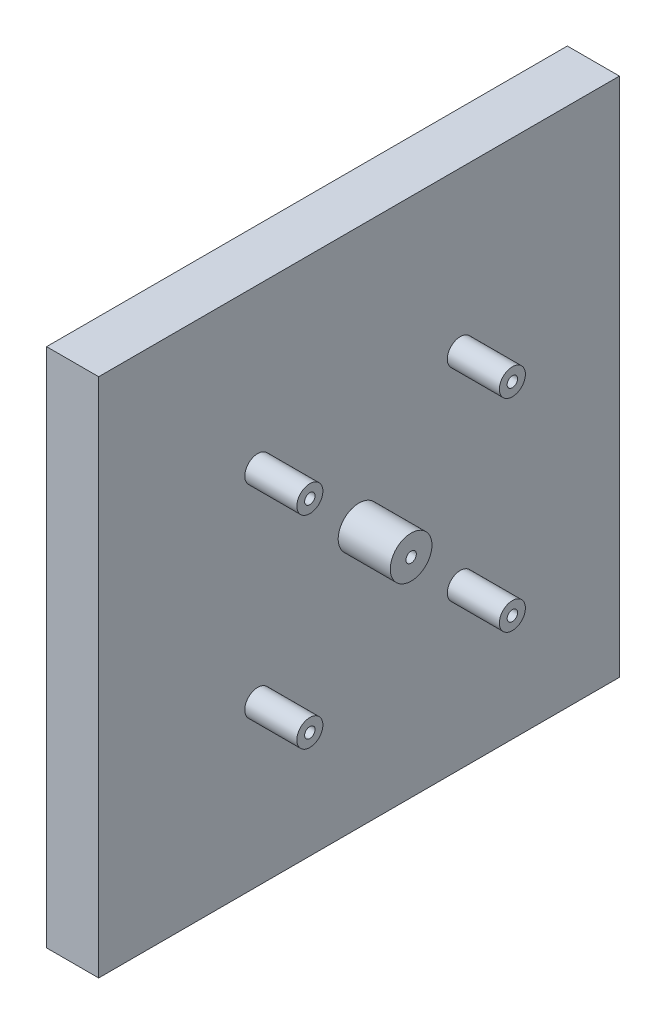
ISO-10303-21;
HEADER;
FILE_DESCRIPTION(('STEP AP214'),'2;1');
FILE_NAME('part.step','',(''),(''),'','','');
FILE_SCHEMA(('AUTOMOTIVE_DESIGN { 1 0 10303 214 1 1 1 1 }'));
ENDSEC;
DATA;
#1=APPLICATION_CONTEXT('core data for automotive mechanical design processes');
#2=APPLICATION_PROTOCOL_DEFINITION('international standard','automotive_design',2000,#1);
#3=PRODUCT_CONTEXT('',#1,'mechanical');
#4=PRODUCT('Part','Part','',(#3));
#5=PRODUCT_RELATED_PRODUCT_CATEGORY('part','',(#4));
#6=PRODUCT_DEFINITION_FORMATION('','',#4);
#7=PRODUCT_DEFINITION_CONTEXT('part definition',#1,'design');
#8=PRODUCT_DEFINITION('design','',#6,#7);
#9=PRODUCT_DEFINITION_SHAPE('','',#8);
#10=(LENGTH_UNIT() NAMED_UNIT(*) SI_UNIT(.MILLI.,.METRE.));
#11=(NAMED_UNIT(*) PLANE_ANGLE_UNIT() SI_UNIT($,.RADIAN.));
#12=(NAMED_UNIT(*) SI_UNIT($,.STERADIAN.) SOLID_ANGLE_UNIT());
#13=UNCERTAINTY_MEASURE_WITH_UNIT(LENGTH_MEASURE(1.E-05),#10,'distance_accuracy_value','');
#14=(GEOMETRIC_REPRESENTATION_CONTEXT(3) GLOBAL_UNCERTAINTY_ASSIGNED_CONTEXT((#13)) GLOBAL_UNIT_ASSIGNED_CONTEXT((#10,
#11,#12)) REPRESENTATION_CONTEXT('',''));
#15=CARTESIAN_POINT('',(0.,0.,0.));
#16=DIRECTION('',(0.,0.,1.));
#17=DIRECTION('',(1.,0.,0.));
#18=AXIS2_PLACEMENT_3D('',#15,#16,#17);
#19=CARTESIAN_POINT('',(10.,0.,0.));
#20=DIRECTION('',(1.,0.,0.));
#21=DIRECTION('',(0.,0.,-1.));
#22=AXIS2_PLACEMENT_3D('',#19,#20,#21);
#23=PLANE('',#22);
#24=CARTESIAN_POINT('',(10.,-19.4454364826299,19.4454364826302));
#25=DIRECTION('',(1.,0.,0.));
#26=DIRECTION('',(0.,0.,-1.));
#27=AXIS2_PLACEMENT_3D('',#24,#25,#26);
#28=CIRCLE('',#27,2.5);
#29=CARTESIAN_POINT('',(10.,-19.4454364826299,16.9454364826302));
#30=VERTEX_POINT('',#29);
#31=EDGE_CURVE('E153',#30,#30,#28,.T.);
#32=ORIENTED_EDGE('',*,*,#31,.F.);
#33=EDGE_LOOP('',(#32));
#34=FACE_BOUND('',#33,.T.);
#35=CARTESIAN_POINT('',(10.,0.,0.));
#36=DIRECTION('',(1.,0.,0.));
#37=DIRECTION('',(0.,0.,-1.));
#38=AXIS2_PLACEMENT_3D('',#35,#36,#37);
#39=CIRCLE('',#38,4.);
#40=CARTESIAN_POINT('',(10.,0.,-4.));
#41=VERTEX_POINT('',#40);
#42=EDGE_CURVE('E135',#41,#41,#39,.T.);
#43=ORIENTED_EDGE('',*,*,#42,.F.);
#44=EDGE_LOOP('',(#43));
#45=FACE_BOUND('',#44,.T.);
#46=DIRECTION('',(0.,0.,1.));
#47=VECTOR('',#46,1.);
#48=CARTESIAN_POINT('',(10.,50.,-50.));
#49=LINE('',#48,#47);
#50=CARTESIAN_POINT('',(10.,50.,-50.));
#51=VERTEX_POINT('',#50);
#52=CARTESIAN_POINT('',(10.,50.,50.));
#53=VERTEX_POINT('',#52);
#54=EDGE_CURVE('E84',#51,#53,#49,.T.);
#55=ORIENTED_EDGE('',*,*,#54,.T.);
#56=DIRECTION('',(0.,-1.,0.));
#57=VECTOR('',#56,1.);
#58=CARTESIAN_POINT('',(10.,50.,50.));
#59=LINE('',#58,#57);
#60=CARTESIAN_POINT('',(10.,-50.,50.));
#61=VERTEX_POINT('',#60);
#62=EDGE_CURVE('E79',#53,#61,#59,.T.);
#63=ORIENTED_EDGE('',*,*,#62,.T.);
#64=DIRECTION('',(0.,0.,-1.));
#65=VECTOR('',#64,1.);
#66=CARTESIAN_POINT('',(10.,-50.,50.));
#67=LINE('',#66,#65);
#68=CARTESIAN_POINT('',(10.,-50.,-50.));
#69=VERTEX_POINT('',#68);
#70=EDGE_CURVE('E82',#61,#69,#67,.T.);
#71=ORIENTED_EDGE('',*,*,#70,.T.);
#72=DIRECTION('',(0.,1.,0.));
#73=VECTOR('',#72,1.);
#74=CARTESIAN_POINT('',(10.,-50.,-50.));
#75=LINE('',#74,#73);
#76=EDGE_CURVE('E49',#69,#51,#75,.T.);
#77=ORIENTED_EDGE('',*,*,#76,.T.);
#78=EDGE_LOOP('',(#55,#63,#71,#77));
#79=FACE_BOUND('',#78,.T.);
#80=CARTESIAN_POINT('',(10.,19.4454364826301,-19.4454364826301));
#81=DIRECTION('',(1.,0.,0.));
#82=DIRECTION('',(0.,0.,-1.));
#83=AXIS2_PLACEMENT_3D('',#80,#81,#82);
#84=CIRCLE('',#83,2.5);
#85=CARTESIAN_POINT('',(10.,19.4454364826301,-21.9454364826301));
#86=VERTEX_POINT('',#85);
#87=EDGE_CURVE('E126',#86,#86,#84,.T.);
#88=ORIENTED_EDGE('',*,*,#87,.F.);
#89=EDGE_LOOP('',(#88));
#90=FACE_BOUND('',#89,.T.);
#91=CARTESIAN_POINT('',(10.,-19.4454364826301,-19.44543648263));
#92=DIRECTION('',(1.,0.,0.));
#93=DIRECTION('',(0.,0.,-1.));
#94=AXIS2_PLACEMENT_3D('',#91,#92,#93);
#95=CIRCLE('',#94,2.5);
#96=CARTESIAN_POINT('',(10.,-19.4454364826301,-21.94543648263));
#97=VERTEX_POINT('',#96);
#98=EDGE_CURVE('E144',#97,#97,#95,.T.);
#99=ORIENTED_EDGE('',*,*,#98,.F.);
#100=EDGE_LOOP('',(#99));
#101=FACE_BOUND('',#100,.T.);
#102=CARTESIAN_POINT('',(10.,19.4454364826303,19.4454364826298));
#103=DIRECTION('',(1.,0.,0.));
#104=DIRECTION('',(0.,0.,-1.));
#105=AXIS2_PLACEMENT_3D('',#102,#103,#104);
#106=CIRCLE('',#105,2.5);
#107=CARTESIAN_POINT('',(10.,19.4454364826303,16.9454364826299));
#108=VERTEX_POINT('',#107);
#109=EDGE_CURVE('E162',#108,#108,#106,.T.);
#110=ORIENTED_EDGE('',*,*,#109,.F.);
#111=EDGE_LOOP('',(#110));
#112=FACE_BOUND('',#111,.T.);
#113=ADVANCED_FACE('F32',(#34,#45,#79,#90,#101,#112),#23,.T.);
#114=CARTESIAN_POINT('',(0.,0.,0.));
#115=DIRECTION('',(1.,0.,0.));
#116=DIRECTION('',(0.,0.,-1.));
#117=AXIS2_PLACEMENT_3D('',#114,#115,#116);
#118=PLANE('',#117);
#119=DIRECTION('',(0.,0.,1.));
#120=VECTOR('',#119,1.);
#121=CARTESIAN_POINT('',(0.,50.,-50.));
#122=LINE('',#121,#120);
#123=CARTESIAN_POINT('',(0.,50.,-50.));
#124=VERTEX_POINT('',#123);
#125=CARTESIAN_POINT('',(0.,50.,50.));
#126=VERTEX_POINT('',#125);
#127=EDGE_CURVE('E96',#124,#126,#122,.T.);
#128=ORIENTED_EDGE('',*,*,#127,.F.);
#129=DIRECTION('',(0.,1.,0.));
#130=VECTOR('',#129,1.);
#131=CARTESIAN_POINT('',(0.,-50.,-50.));
#132=LINE('',#131,#130);
#133=CARTESIAN_POINT('',(0.,-50.,-50.));
#134=VERTEX_POINT('',#133);
#135=EDGE_CURVE('E72',#134,#124,#132,.T.);
#136=ORIENTED_EDGE('',*,*,#135,.F.);
#137=DIRECTION('',(0.,0.,-1.));
#138=VECTOR('',#137,1.);
#139=CARTESIAN_POINT('',(0.,-50.,50.));
#140=LINE('',#139,#138);
#141=CARTESIAN_POINT('',(0.,-50.,50.));
#142=VERTEX_POINT('',#141);
#143=EDGE_CURVE('E66',#142,#134,#140,.T.);
#144=ORIENTED_EDGE('',*,*,#143,.F.);
#145=DIRECTION('',(0.,-1.,0.));
#146=VECTOR('',#145,1.);
#147=CARTESIAN_POINT('',(0.,50.,50.));
#148=LINE('',#147,#146);
#149=EDGE_CURVE('E88',#126,#142,#148,.T.);
#150=ORIENTED_EDGE('',*,*,#149,.F.);
#151=EDGE_LOOP('',(#128,#136,#144,#150));
#152=FACE_BOUND('',#151,.T.);
#153=CARTESIAN_POINT('',(0.,19.4454364826301,-19.4454364826301));
#154=DIRECTION('',(1.,0.,0.));
#155=DIRECTION('',(0.,0.,-1.));
#156=AXIS2_PLACEMENT_3D('',#153,#154,#155);
#157=CIRCLE('',#156,1.);
#158=CARTESIAN_POINT('',(0.,19.4454364826301,-20.4454364826301));
#159=VERTEX_POINT('',#158);
#160=EDGE_CURVE('E99',#159,#159,#157,.T.);
#161=ORIENTED_EDGE('',*,*,#160,.T.);
#162=EDGE_LOOP('',(#161));
#163=FACE_BOUND('',#162,.T.);
#164=CARTESIAN_POINT('',(0.,-19.4454364826301,-19.4454364826301));
#165=DIRECTION('',(1.,0.,0.));
#166=DIRECTION('',(0.,0.,-1.));
#167=AXIS2_PLACEMENT_3D('',#164,#165,#166);
#168=CIRCLE('',#167,1.);
#169=CARTESIAN_POINT('',(0.,-19.4454364826301,-20.4454364826301));
#170=VERTEX_POINT('',#169);
#171=EDGE_CURVE('E113',#170,#170,#168,.T.);
#172=ORIENTED_EDGE('',*,*,#171,.T.);
#173=EDGE_LOOP('',(#172));
#174=FACE_BOUND('',#173,.T.);
#175=CARTESIAN_POINT('',(0.,0.,0.));
#176=DIRECTION('',(1.,0.,0.));
#177=DIRECTION('',(0.,0.,-1.));
#178=AXIS2_PLACEMENT_3D('',#175,#176,#177);
#179=CIRCLE('',#178,1.);
#180=CARTESIAN_POINT('',(0.,0.,-1.));
#181=VERTEX_POINT('',#180);
#182=EDGE_CURVE('E116',#181,#181,#179,.T.);
#183=ORIENTED_EDGE('',*,*,#182,.T.);
#184=EDGE_LOOP('',(#183));
#185=FACE_BOUND('',#184,.T.);
#186=CARTESIAN_POINT('',(0.,-19.4454364826301,19.44543648263));
#187=DIRECTION('',(1.,0.,0.));
#188=DIRECTION('',(0.,0.,-1.));
#189=AXIS2_PLACEMENT_3D('',#186,#187,#188);
#190=CIRCLE('',#189,1.00000000000001);
#191=CARTESIAN_POINT('',(0.,-19.4454364826301,18.44543648263));
#192=VERTEX_POINT('',#191);
#193=EDGE_CURVE('E119',#192,#192,#190,.T.);
#194=ORIENTED_EDGE('',*,*,#193,.T.);
#195=EDGE_LOOP('',(#194));
#196=FACE_BOUND('',#195,.T.);
#197=CARTESIAN_POINT('',(0.,19.4454364826301,19.4454364826301));
#198=DIRECTION('',(1.,0.,0.));
#199=DIRECTION('',(0.,0.,-1.));
#200=AXIS2_PLACEMENT_3D('',#197,#198,#199);
#201=CIRCLE('',#200,1.);
#202=CARTESIAN_POINT('',(0.,19.4454364826301,18.4454364826301));
#203=VERTEX_POINT('',#202);
#204=EDGE_CURVE('E122',#203,#203,#201,.T.);
#205=ORIENTED_EDGE('',*,*,#204,.T.);
#206=EDGE_LOOP('',(#205));
#207=FACE_BOUND('',#206,.T.);
#208=ADVANCED_FACE('F107',(#152,#163,#174,#185,#196,#207),#118,.F.);
#209=CARTESIAN_POINT('',(10.,50.,-50.));
#210=DIRECTION('',(0.,-1.,0.));
#211=DIRECTION('',(0.,0.,-1.));
#212=AXIS2_PLACEMENT_3D('',#209,#210,#211);
#213=PLANE('',#212);
#214=ORIENTED_EDGE('',*,*,#127,.T.);
#215=DIRECTION('',(-1.,0.,0.));
#216=VECTOR('',#215,1.);
#217=CARTESIAN_POINT('',(10.,50.,50.));
#218=LINE('',#217,#216);
#219=EDGE_CURVE('E11',#53,#126,#218,.T.);
#220=ORIENTED_EDGE('',*,*,#219,.F.);
#221=ORIENTED_EDGE('',*,*,#54,.F.);
#222=DIRECTION('',(-1.,0.,0.));
#223=VECTOR('',#222,1.);
#224=CARTESIAN_POINT('',(10.,50.,-50.));
#225=LINE('',#224,#223);
#226=EDGE_CURVE('E92',#51,#124,#225,.T.);
#227=ORIENTED_EDGE('',*,*,#226,.T.);
#228=EDGE_LOOP('',(#214,#220,#221,#227));
#229=FACE_BOUND('',#228,.T.);
#230=ADVANCED_FACE('F34',(#229),#213,.F.);
#231=CARTESIAN_POINT('',(10.,50.,50.));
#232=DIRECTION('',(0.,0.,-1.));
#233=DIRECTION('',(0.,1.,0.));
#234=AXIS2_PLACEMENT_3D('',#231,#232,#233);
#235=PLANE('',#234);
#236=ORIENTED_EDGE('',*,*,#149,.T.);
#237=DIRECTION('',(-1.,0.,0.));
#238=VECTOR('',#237,1.);
#239=CARTESIAN_POINT('',(10.,-50.,50.));
#240=LINE('',#239,#238);
#241=EDGE_CURVE('E41',#61,#142,#240,.T.);
#242=ORIENTED_EDGE('',*,*,#241,.F.);
#243=ORIENTED_EDGE('',*,*,#62,.F.);
#244=ORIENTED_EDGE('',*,*,#219,.T.);
#245=EDGE_LOOP('',(#236,#242,#243,#244));
#246=FACE_BOUND('',#245,.T.);
#247=ADVANCED_FACE('F87',(#246),#235,.F.);
#248=CARTESIAN_POINT('',(10.,-50.,50.));
#249=DIRECTION('',(0.,1.,0.));
#250=DIRECTION('',(0.,0.,1.));
#251=AXIS2_PLACEMENT_3D('',#248,#249,#250);
#252=PLANE('',#251);
#253=ORIENTED_EDGE('',*,*,#143,.T.);
#254=DIRECTION('',(-1.,0.,0.));
#255=VECTOR('',#254,1.);
#256=CARTESIAN_POINT('',(10.,-50.,-50.));
#257=LINE('',#256,#255);
#258=EDGE_CURVE('E89',#69,#134,#257,.T.);
#259=ORIENTED_EDGE('',*,*,#258,.F.);
#260=ORIENTED_EDGE('',*,*,#70,.F.);
#261=ORIENTED_EDGE('',*,*,#241,.T.);
#262=EDGE_LOOP('',(#253,#259,#260,#261));
#263=FACE_BOUND('',#262,.T.);
#264=ADVANCED_FACE('F90',(#263),#252,.F.);
#265=CARTESIAN_POINT('',(10.,-50.,-50.));
#266=DIRECTION('',(0.,0.,1.));
#267=DIRECTION('',(0.,-1.,0.));
#268=AXIS2_PLACEMENT_3D('',#265,#266,#267);
#269=PLANE('',#268);
#270=ORIENTED_EDGE('',*,*,#135,.T.);
#271=ORIENTED_EDGE('',*,*,#226,.F.);
#272=ORIENTED_EDGE('',*,*,#76,.F.);
#273=ORIENTED_EDGE('',*,*,#258,.T.);
#274=EDGE_LOOP('',(#270,#271,#272,#273));
#275=FACE_BOUND('',#274,.T.);
#276=ADVANCED_FACE('F104',(#275),#269,.F.);
#277=CARTESIAN_POINT('',(10.,19.4454364826301,-19.4454364826301));
#278=DIRECTION('',(-1.,0.,0.));
#279=DIRECTION('',(0.,0.,1.));
#280=AXIS2_PLACEMENT_3D('',#277,#278,#279);
#281=CYLINDRICAL_SURFACE('',#280,1.);
#282=ORIENTED_EDGE('',*,*,#160,.F.);
#283=EDGE_LOOP('',(#282));
#284=FACE_BOUND('',#283,.T.);
#285=CARTESIAN_POINT('',(20.,19.4454364826301,-19.4454364826301));
#286=DIRECTION('',(1.,0.,0.));
#287=DIRECTION('',(0.,0.,-1.));
#288=AXIS2_PLACEMENT_3D('',#285,#286,#287);
#289=CIRCLE('',#288,1.);
#290=CARTESIAN_POINT('',(20.,19.4454364826301,-20.4454364826301));
#291=VERTEX_POINT('',#290);
#292=EDGE_CURVE('E129',#291,#291,#289,.T.);
#293=ORIENTED_EDGE('',*,*,#292,.T.);
#294=EDGE_LOOP('',(#293));
#295=FACE_BOUND('',#294,.T.);
#296=ADVANCED_FACE('F198',(#284,#295),#281,.F.);
#297=CARTESIAN_POINT('',(10.,-19.4454364826301,-19.4454364826301));
#298=DIRECTION('',(-1.,0.,0.));
#299=DIRECTION('',(0.,0.,1.));
#300=AXIS2_PLACEMENT_3D('',#297,#298,#299);
#301=CYLINDRICAL_SURFACE('',#300,1.);
#302=ORIENTED_EDGE('',*,*,#171,.F.);
#303=EDGE_LOOP('',(#302));
#304=FACE_BOUND('',#303,.T.);
#305=CARTESIAN_POINT('',(20.,-19.4454364826301,-19.44543648263));
#306=DIRECTION('',(1.,0.,0.));
#307=DIRECTION('',(0.,0.,-1.));
#308=AXIS2_PLACEMENT_3D('',#305,#306,#307);
#309=CIRCLE('',#308,1.);
#310=CARTESIAN_POINT('',(20.,-19.4454364826301,-20.44543648263));
#311=VERTEX_POINT('',#310);
#312=EDGE_CURVE('E147',#311,#311,#309,.T.);
#313=ORIENTED_EDGE('',*,*,#312,.T.);
#314=EDGE_LOOP('',(#313));
#315=FACE_BOUND('',#314,.T.);
#316=ADVANCED_FACE('F240',(#304,#315),#301,.F.);
#317=CARTESIAN_POINT('',(10.,0.,0.));
#318=DIRECTION('',(-1.,0.,0.));
#319=DIRECTION('',(0.,0.,1.));
#320=AXIS2_PLACEMENT_3D('',#317,#318,#319);
#321=CYLINDRICAL_SURFACE('',#320,1.);
#322=ORIENTED_EDGE('',*,*,#182,.F.);
#323=EDGE_LOOP('',(#322));
#324=FACE_BOUND('',#323,.T.);
#325=CARTESIAN_POINT('',(20.,0.,0.));
#326=DIRECTION('',(1.,0.,0.));
#327=DIRECTION('',(0.,0.,-1.));
#328=AXIS2_PLACEMENT_3D('',#325,#326,#327);
#329=CIRCLE('',#328,1.);
#330=CARTESIAN_POINT('',(20.,0.,-1.));
#331=VERTEX_POINT('',#330);
#332=EDGE_CURVE('E138',#331,#331,#329,.T.);
#333=ORIENTED_EDGE('',*,*,#332,.T.);
#334=EDGE_LOOP('',(#333));
#335=FACE_BOUND('',#334,.T.);
#336=ADVANCED_FACE('F251',(#324,#335),#321,.F.);
#337=CARTESIAN_POINT('',(10.,-19.4454364826301,19.44543648263));
#338=DIRECTION('',(-1.,0.,0.));
#339=DIRECTION('',(0.,0.,1.));
#340=AXIS2_PLACEMENT_3D('',#337,#338,#339);
#341=CYLINDRICAL_SURFACE('',#340,1.00000000000001);
#342=ORIENTED_EDGE('',*,*,#193,.F.);
#343=EDGE_LOOP('',(#342));
#344=FACE_BOUND('',#343,.T.);
#345=CARTESIAN_POINT('',(20.,-19.4454364826299,19.4454364826302));
#346=DIRECTION('',(1.,0.,0.));
#347=DIRECTION('',(0.,0.,-1.));
#348=AXIS2_PLACEMENT_3D('',#345,#346,#347);
#349=CIRCLE('',#348,1.);
#350=CARTESIAN_POINT('',(20.,-19.4454364826299,18.4454364826302));
#351=VERTEX_POINT('',#350);
#352=EDGE_CURVE('E156',#351,#351,#349,.T.);
#353=ORIENTED_EDGE('',*,*,#352,.T.);
#354=EDGE_LOOP('',(#353));
#355=FACE_BOUND('',#354,.T.);
#356=ADVANCED_FACE('F261',(#344,#355),#341,.F.);
#357=CARTESIAN_POINT('',(10.,19.4454364826301,19.4454364826301));
#358=DIRECTION('',(-1.,0.,0.));
#359=DIRECTION('',(0.,0.,1.));
#360=AXIS2_PLACEMENT_3D('',#357,#358,#359);
#361=CYLINDRICAL_SURFACE('',#360,1.);
#362=ORIENTED_EDGE('',*,*,#204,.F.);
#363=EDGE_LOOP('',(#362));
#364=FACE_BOUND('',#363,.T.);
#365=CARTESIAN_POINT('',(20.,19.4454364826303,19.4454364826298));
#366=DIRECTION('',(1.,0.,0.));
#367=DIRECTION('',(0.,0.,-1.));
#368=AXIS2_PLACEMENT_3D('',#365,#366,#367);
#369=CIRCLE('',#368,1.);
#370=CARTESIAN_POINT('',(20.,19.4454364826303,18.4454364826298));
#371=VERTEX_POINT('',#370);
#372=EDGE_CURVE('E165',#371,#371,#369,.T.);
#373=ORIENTED_EDGE('',*,*,#372,.T.);
#374=EDGE_LOOP('',(#373));
#375=FACE_BOUND('',#374,.T.);
#376=ADVANCED_FACE('F171',(#364,#375),#361,.F.);
#377=CARTESIAN_POINT('',(20.,19.4454364826301,-19.4454364826301));
#378=DIRECTION('',(1.,0.,0.));
#379=DIRECTION('',(0.,0.,-1.));
#380=AXIS2_PLACEMENT_3D('',#377,#378,#379);
#381=PLANE('',#380);
#382=CARTESIAN_POINT('',(20.,19.4454364826301,-19.4454364826301));
#383=DIRECTION('',(1.,0.,0.));
#384=DIRECTION('',(0.,0.,-1.));
#385=AXIS2_PLACEMENT_3D('',#382,#383,#384);
#386=CIRCLE('',#385,2.5);
#387=CARTESIAN_POINT('',(20.,19.4454364826301,-21.9454364826301));
#388=VERTEX_POINT('',#387);
#389=EDGE_CURVE('E125',#388,#388,#386,.T.);
#390=ORIENTED_EDGE('',*,*,#389,.T.);
#391=EDGE_LOOP('',(#390));
#392=FACE_BOUND('',#391,.T.);
#393=ORIENTED_EDGE('',*,*,#292,.F.);
#394=EDGE_LOOP('',(#393));
#395=FACE_BOUND('',#394,.T.);
#396=ADVANCED_FACE('F281',(#392,#395),#381,.T.);
#397=CARTESIAN_POINT('',(20.,19.4454364826301,-19.4454364826301));
#398=DIRECTION('',(-1.,0.,0.));
#399=DIRECTION('',(0.,0.,1.));
#400=AXIS2_PLACEMENT_3D('',#397,#398,#399);
#401=CYLINDRICAL_SURFACE('',#400,2.5);
#402=ORIENTED_EDGE('',*,*,#389,.F.);
#403=EDGE_LOOP('',(#402));
#404=FACE_BOUND('',#403,.T.);
#405=ORIENTED_EDGE('',*,*,#87,.T.);
#406=EDGE_LOOP('',(#405));
#407=FACE_BOUND('',#406,.T.);
#408=ADVANCED_FACE('F305',(#404,#407),#401,.T.);
#409=CARTESIAN_POINT('',(20.,0.,0.));
#410=DIRECTION('',(1.,0.,0.));
#411=DIRECTION('',(0.,0.,-1.));
#412=AXIS2_PLACEMENT_3D('',#409,#410,#411);
#413=PLANE('',#412);
#414=CARTESIAN_POINT('',(20.,0.,0.));
#415=DIRECTION('',(1.,0.,0.));
#416=DIRECTION('',(0.,0.,-1.));
#417=AXIS2_PLACEMENT_3D('',#414,#415,#416);
#418=CIRCLE('',#417,4.);
#419=CARTESIAN_POINT('',(20.,0.,-4.));
#420=VERTEX_POINT('',#419);
#421=EDGE_CURVE('E134',#420,#420,#418,.T.);
#422=ORIENTED_EDGE('',*,*,#421,.T.);
#423=EDGE_LOOP('',(#422));
#424=FACE_BOUND('',#423,.T.);
#425=ORIENTED_EDGE('',*,*,#332,.F.);
#426=EDGE_LOOP('',(#425));
#427=FACE_BOUND('',#426,.T.);
#428=ADVANCED_FACE('F315',(#424,#427),#413,.T.);
#429=CARTESIAN_POINT('',(20.,0.,0.));
#430=DIRECTION('',(-1.,0.,0.));
#431=DIRECTION('',(0.,0.,1.));
#432=AXIS2_PLACEMENT_3D('',#429,#430,#431);
#433=CYLINDRICAL_SURFACE('',#432,4.);
#434=ORIENTED_EDGE('',*,*,#421,.F.);
#435=EDGE_LOOP('',(#434));
#436=FACE_BOUND('',#435,.T.);
#437=ORIENTED_EDGE('',*,*,#42,.T.);
#438=EDGE_LOOP('',(#437));
#439=FACE_BOUND('',#438,.T.);
#440=ADVANCED_FACE('F325',(#436,#439),#433,.T.);
#441=CARTESIAN_POINT('',(20.,-19.4454364826301,-19.44543648263));
#442=DIRECTION('',(1.,0.,0.));
#443=DIRECTION('',(0.,0.,-1.));
#444=AXIS2_PLACEMENT_3D('',#441,#442,#443);
#445=PLANE('',#444);
#446=CARTESIAN_POINT('',(20.,-19.4454364826301,-19.44543648263));
#447=DIRECTION('',(1.,0.,0.));
#448=DIRECTION('',(0.,0.,-1.));
#449=AXIS2_PLACEMENT_3D('',#446,#447,#448);
#450=CIRCLE('',#449,2.5);
#451=CARTESIAN_POINT('',(20.,-19.4454364826301,-21.94543648263));
#452=VERTEX_POINT('',#451);
#453=EDGE_CURVE('E143',#452,#452,#450,.T.);
#454=ORIENTED_EDGE('',*,*,#453,.T.);
#455=EDGE_LOOP('',(#454));
#456=FACE_BOUND('',#455,.T.);
#457=ORIENTED_EDGE('',*,*,#312,.F.);
#458=EDGE_LOOP('',(#457));
#459=FACE_BOUND('',#458,.T.);
#460=ADVANCED_FACE('F335',(#456,#459),#445,.T.);
#461=CARTESIAN_POINT('',(20.,-19.4454364826301,-19.44543648263));
#462=DIRECTION('',(-1.,0.,0.));
#463=DIRECTION('',(0.,0.,1.));
#464=AXIS2_PLACEMENT_3D('',#461,#462,#463);
#465=CYLINDRICAL_SURFACE('',#464,2.5);
#466=ORIENTED_EDGE('',*,*,#453,.F.);
#467=EDGE_LOOP('',(#466));
#468=FACE_BOUND('',#467,.T.);
#469=ORIENTED_EDGE('',*,*,#98,.T.);
#470=EDGE_LOOP('',(#469));
#471=FACE_BOUND('',#470,.T.);
#472=ADVANCED_FACE('F345',(#468,#471),#465,.T.);
#473=CARTESIAN_POINT('',(20.,-19.4454364826299,19.4454364826302));
#474=DIRECTION('',(1.,0.,0.));
#475=DIRECTION('',(0.,0.,-1.));
#476=AXIS2_PLACEMENT_3D('',#473,#474,#475);
#477=PLANE('',#476);
#478=CARTESIAN_POINT('',(20.,-19.4454364826299,19.4454364826302));
#479=DIRECTION('',(1.,0.,0.));
#480=DIRECTION('',(0.,0.,-1.));
#481=AXIS2_PLACEMENT_3D('',#478,#479,#480);
#482=CIRCLE('',#481,2.5);
#483=CARTESIAN_POINT('',(20.,-19.4454364826299,16.9454364826302));
#484=VERTEX_POINT('',#483);
#485=EDGE_CURVE('E152',#484,#484,#482,.T.);
#486=ORIENTED_EDGE('',*,*,#485,.T.);
#487=EDGE_LOOP('',(#486));
#488=FACE_BOUND('',#487,.T.);
#489=ORIENTED_EDGE('',*,*,#352,.F.);
#490=EDGE_LOOP('',(#489));
#491=FACE_BOUND('',#490,.T.);
#492=ADVANCED_FACE('F185',(#488,#491),#477,.T.);
#493=CARTESIAN_POINT('',(20.,-19.4454364826299,19.4454364826302));
#494=DIRECTION('',(-1.,0.,0.));
#495=DIRECTION('',(0.,0.,1.));
#496=AXIS2_PLACEMENT_3D('',#493,#494,#495);
#497=CYLINDRICAL_SURFACE('',#496,2.5);
#498=ORIENTED_EDGE('',*,*,#485,.F.);
#499=EDGE_LOOP('',(#498));
#500=FACE_BOUND('',#499,.T.);
#501=ORIENTED_EDGE('',*,*,#31,.T.);
#502=EDGE_LOOP('',(#501));
#503=FACE_BOUND('',#502,.T.);
#504=ADVANCED_FACE('F176',(#500,#503),#497,.T.);
#505=CARTESIAN_POINT('',(20.,19.4454364826303,19.4454364826298));
#506=DIRECTION('',(1.,0.,0.));
#507=DIRECTION('',(0.,0.,-1.));
#508=AXIS2_PLACEMENT_3D('',#505,#506,#507);
#509=PLANE('',#508);
#510=CARTESIAN_POINT('',(20.,19.4454364826303,19.4454364826298));
#511=DIRECTION('',(1.,0.,0.));
#512=DIRECTION('',(0.,0.,-1.));
#513=AXIS2_PLACEMENT_3D('',#510,#511,#512);
#514=CIRCLE('',#513,2.5);
#515=CARTESIAN_POINT('',(20.,19.4454364826303,16.9454364826299));
#516=VERTEX_POINT('',#515);
#517=EDGE_CURVE('E161',#516,#516,#514,.T.);
#518=ORIENTED_EDGE('',*,*,#517,.T.);
#519=EDGE_LOOP('',(#518));
#520=FACE_BOUND('',#519,.T.);
#521=ORIENTED_EDGE('',*,*,#372,.F.);
#522=EDGE_LOOP('',(#521));
#523=FACE_BOUND('',#522,.T.);
#524=ADVANCED_FACE('F173',(#520,#523),#509,.T.);
#525=CARTESIAN_POINT('',(20.,19.4454364826303,19.4454364826298));
#526=DIRECTION('',(-1.,0.,0.));
#527=DIRECTION('',(0.,0.,1.));
#528=AXIS2_PLACEMENT_3D('',#525,#526,#527);
#529=CYLINDRICAL_SURFACE('',#528,2.5);
#530=ORIENTED_EDGE('',*,*,#517,.F.);
#531=EDGE_LOOP('',(#530));
#532=FACE_BOUND('',#531,.T.);
#533=ORIENTED_EDGE('',*,*,#109,.T.);
#534=EDGE_LOOP('',(#533));
#535=FACE_BOUND('',#534,.T.);
#536=ADVANCED_FACE('F175',(#532,#535),#529,.T.);
#537=CLOSED_SHELL('',(#113,#208,#230,#247,#264,#276,#296,#316,#336,#356,#376,#396,#408,#428,
#440,#460,#472,#492,#504,#524,#536));
#538=MANIFOLD_SOLID_BREP('B2',#537);
#539=ADVANCED_BREP_SHAPE_REPRESENTATION('',(#18,#538),#14);
#540=SHAPE_DEFINITION_REPRESENTATION(#9,#539);
ENDSEC;
END-ISO-10303-21;
